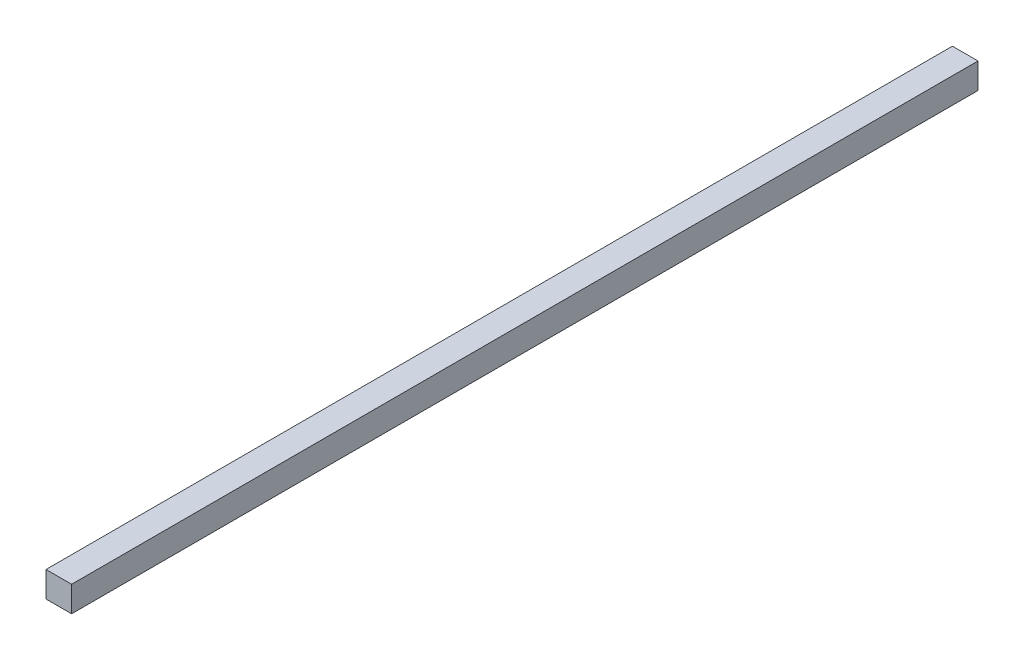
ISO-10303-21;
HEADER;
FILE_DESCRIPTION(('STEP AP214'),'2;1');
FILE_NAME('part.step','',(''),(''),'','','');
FILE_SCHEMA(('AUTOMOTIVE_DESIGN { 1 0 10303 214 1 1 1 1 }'));
ENDSEC;
DATA;
#1=APPLICATION_CONTEXT('core data for automotive mechanical design processes');
#2=APPLICATION_PROTOCOL_DEFINITION('international standard','automotive_design',2000,#1);
#3=PRODUCT_CONTEXT('',#1,'mechanical');
#4=PRODUCT('Part','Part','',(#3));
#5=PRODUCT_RELATED_PRODUCT_CATEGORY('part','',(#4));
#6=PRODUCT_DEFINITION_FORMATION('','',#4);
#7=PRODUCT_DEFINITION_CONTEXT('part definition',#1,'design');
#8=PRODUCT_DEFINITION('design','',#6,#7);
#9=PRODUCT_DEFINITION_SHAPE('','',#8);
#10=(LENGTH_UNIT() NAMED_UNIT(*) SI_UNIT(.MILLI.,.METRE.));
#11=(NAMED_UNIT(*) PLANE_ANGLE_UNIT() SI_UNIT($,.RADIAN.));
#12=(NAMED_UNIT(*) SI_UNIT($,.STERADIAN.) SOLID_ANGLE_UNIT());
#13=UNCERTAINTY_MEASURE_WITH_UNIT(LENGTH_MEASURE(1.E-05),#10,'distance_accuracy_value','');
#14=(GEOMETRIC_REPRESENTATION_CONTEXT(3) GLOBAL_UNCERTAINTY_ASSIGNED_CONTEXT((#13)) GLOBAL_UNIT_ASSIGNED_CONTEXT((#10,
#11,#12)) REPRESENTATION_CONTEXT('',''));
#15=CARTESIAN_POINT('',(0.,0.,0.));
#16=DIRECTION('',(0.,0.,1.));
#17=DIRECTION('',(1.,0.,0.));
#18=AXIS2_PLACEMENT_3D('',#15,#16,#17);
#19=CARTESIAN_POINT('',(0.,0.,224.79));
#20=DIRECTION('',(1.,0.,0.));
#21=DIRECTION('',(0.,0.,-1.));
#22=AXIS2_PLACEMENT_3D('',#19,#20,#21);
#23=PLANE('',#22);
#24=DIRECTION('',(0.,-1.,0.));
#25=VECTOR('',#24,1.);
#26=CARTESIAN_POINT('',(0.,0.,0.));
#27=LINE('',#26,#25);
#28=CARTESIAN_POINT('',(0.,6.35,0.));
#29=VERTEX_POINT('',#28);
#30=CARTESIAN_POINT('',(0.,0.,0.));
#31=VERTEX_POINT('',#30);
#32=EDGE_CURVE('E95',#29,#31,#27,.T.);
#33=ORIENTED_EDGE('',*,*,#32,.T.);
#34=DIRECTION('',(0.,0.,-1.));
#35=VECTOR('',#34,1.);
#36=CARTESIAN_POINT('',(0.,0.,224.79));
#37=LINE('',#36,#35);
#38=CARTESIAN_POINT('',(0.,0.,224.79));
#39=VERTEX_POINT('',#38);
#40=EDGE_CURVE('E11',#39,#31,#37,.T.);
#41=ORIENTED_EDGE('',*,*,#40,.F.);
#42=DIRECTION('',(0.,-1.,0.));
#43=VECTOR('',#42,1.);
#44=CARTESIAN_POINT('',(0.,0.,224.79));
#45=LINE('',#44,#43);
#46=CARTESIAN_POINT('',(0.,6.35,224.79));
#47=VERTEX_POINT('',#46);
#48=EDGE_CURVE('E83',#47,#39,#45,.T.);
#49=ORIENTED_EDGE('',*,*,#48,.F.);
#50=DIRECTION('',(0.,0.,-1.));
#51=VECTOR('',#50,1.);
#52=CARTESIAN_POINT('',(0.,6.35,224.79));
#53=LINE('',#52,#51);
#54=EDGE_CURVE('E91',#47,#29,#53,.T.);
#55=ORIENTED_EDGE('',*,*,#54,.T.);
#56=EDGE_LOOP('',(#33,#41,#49,#55));
#57=FACE_BOUND('',#56,.T.);
#58=ADVANCED_FACE('F32',(#57),#23,.F.);
#59=CARTESIAN_POINT('',(0.,0.,224.79));
#60=DIRECTION('',(0.,1.,0.));
#61=DIRECTION('',(0.,0.,1.));
#62=AXIS2_PLACEMENT_3D('',#59,#60,#61);
#63=PLANE('',#62);
#64=DIRECTION('',(1.,0.,0.));
#65=VECTOR('',#64,1.);
#66=CARTESIAN_POINT('',(0.,0.,0.));
#67=LINE('',#66,#65);
#68=CARTESIAN_POINT('',(6.35,0.,0.));
#69=VERTEX_POINT('',#68);
#70=EDGE_CURVE('E87',#31,#69,#67,.T.);
#71=ORIENTED_EDGE('',*,*,#70,.T.);
#72=DIRECTION('',(0.,0.,-1.));
#73=VECTOR('',#72,1.);
#74=CARTESIAN_POINT('',(6.35,0.,224.79));
#75=LINE('',#74,#73);
#76=CARTESIAN_POINT('',(6.35,0.,224.79));
#77=VERTEX_POINT('',#76);
#78=EDGE_CURVE('E40',#77,#69,#75,.T.);
#79=ORIENTED_EDGE('',*,*,#78,.F.);
#80=DIRECTION('',(1.,0.,0.));
#81=VECTOR('',#80,1.);
#82=CARTESIAN_POINT('',(0.,0.,224.79));
#83=LINE('',#82,#81);
#84=EDGE_CURVE('E78',#39,#77,#83,.T.);
#85=ORIENTED_EDGE('',*,*,#84,.F.);
#86=ORIENTED_EDGE('',*,*,#40,.T.);
#87=EDGE_LOOP('',(#71,#79,#85,#86));
#88=FACE_BOUND('',#87,.T.);
#89=ADVANCED_FACE('F86',(#88),#63,.F.);
#90=CARTESIAN_POINT('',(6.35,0.,224.79));
#91=DIRECTION('',(-1.,0.,0.));
#92=DIRECTION('',(0.,0.,1.));
#93=AXIS2_PLACEMENT_3D('',#90,#91,#92);
#94=PLANE('',#93);
#95=DIRECTION('',(0.,1.,0.));
#96=VECTOR('',#95,1.);
#97=CARTESIAN_POINT('',(6.35,0.,0.));
#98=LINE('',#97,#96);
#99=CARTESIAN_POINT('',(6.35,6.35,0.));
#100=VERTEX_POINT('',#99);
#101=EDGE_CURVE('E65',#69,#100,#98,.T.);
#102=ORIENTED_EDGE('',*,*,#101,.T.);
#103=DIRECTION('',(0.,0.,-1.));
#104=VECTOR('',#103,1.);
#105=CARTESIAN_POINT('',(6.35,6.35,224.79));
#106=LINE('',#105,#104);
#107=CARTESIAN_POINT('',(6.35,6.35,224.79));
#108=VERTEX_POINT('',#107);
#109=EDGE_CURVE('E88',#108,#100,#106,.T.);
#110=ORIENTED_EDGE('',*,*,#109,.F.);
#111=DIRECTION('',(0.,1.,0.));
#112=VECTOR('',#111,1.);
#113=CARTESIAN_POINT('',(6.35,0.,224.79));
#114=LINE('',#113,#112);
#115=EDGE_CURVE('E81',#77,#108,#114,.T.);
#116=ORIENTED_EDGE('',*,*,#115,.F.);
#117=ORIENTED_EDGE('',*,*,#78,.T.);
#118=EDGE_LOOP('',(#102,#110,#116,#117));
#119=FACE_BOUND('',#118,.T.);
#120=ADVANCED_FACE('F89',(#119),#94,.F.);
#121=CARTESIAN_POINT('',(0.,6.35,224.79));
#122=DIRECTION('',(0.,-1.,0.));
#123=DIRECTION('',(0.,0.,-1.));
#124=AXIS2_PLACEMENT_3D('',#121,#122,#123);
#125=PLANE('',#124);
#126=DIRECTION('',(-1.,0.,0.));
#127=VECTOR('',#126,1.);
#128=CARTESIAN_POINT('',(0.,6.35,0.));
#129=LINE('',#128,#127);
#130=EDGE_CURVE('E71',#100,#29,#129,.T.);
#131=ORIENTED_EDGE('',*,*,#130,.T.);
#132=ORIENTED_EDGE('',*,*,#54,.F.);
#133=DIRECTION('',(-1.,0.,0.));
#134=VECTOR('',#133,1.);
#135=CARTESIAN_POINT('',(0.,6.35,224.79));
#136=LINE('',#135,#134);
#137=EDGE_CURVE('E48',#108,#47,#136,.T.);
#138=ORIENTED_EDGE('',*,*,#137,.F.);
#139=ORIENTED_EDGE('',*,*,#109,.T.);
#140=EDGE_LOOP('',(#131,#132,#138,#139));
#141=FACE_BOUND('',#140,.T.);
#142=ADVANCED_FACE('F102',(#141),#125,.F.);
#143=CARTESIAN_POINT('',(0.,0.,224.79));
#144=DIRECTION('',(0.,0.,-1.));
#145=DIRECTION('',(-1.,0.,0.));
#146=AXIS2_PLACEMENT_3D('',#143,#144,#145);
#147=PLANE('',#146);
#148=ORIENTED_EDGE('',*,*,#48,.T.);
#149=ORIENTED_EDGE('',*,*,#84,.T.);
#150=ORIENTED_EDGE('',*,*,#115,.T.);
#151=ORIENTED_EDGE('',*,*,#137,.T.);
#152=EDGE_LOOP('',(#148,#149,#150,#151));
#153=FACE_BOUND('',#152,.T.);
#154=ADVANCED_FACE('F79',(#153),#147,.F.);
#155=CARTESIAN_POINT('',(0.,0.,0.));
#156=DIRECTION('',(0.,0.,-1.));
#157=DIRECTION('',(-1.,0.,0.));
#158=AXIS2_PLACEMENT_3D('',#155,#156,#157);
#159=PLANE('',#158);
#160=ORIENTED_EDGE('',*,*,#32,.F.);
#161=ORIENTED_EDGE('',*,*,#130,.F.);
#162=ORIENTED_EDGE('',*,*,#101,.F.);
#163=ORIENTED_EDGE('',*,*,#70,.F.);
#164=EDGE_LOOP('',(#160,#161,#162,#163));
#165=FACE_BOUND('',#164,.T.);
#166=ADVANCED_FACE('F105',(#165),#159,.T.);
#167=CLOSED_SHELL('',(#58,#89,#120,#142,#154,#166));
#168=MANIFOLD_SOLID_BREP('B2',#167);
#169=ADVANCED_BREP_SHAPE_REPRESENTATION('',(#18,#168),#14);
#170=SHAPE_DEFINITION_REPRESENTATION(#9,#169);
ENDSEC;
END-ISO-10303-21;
